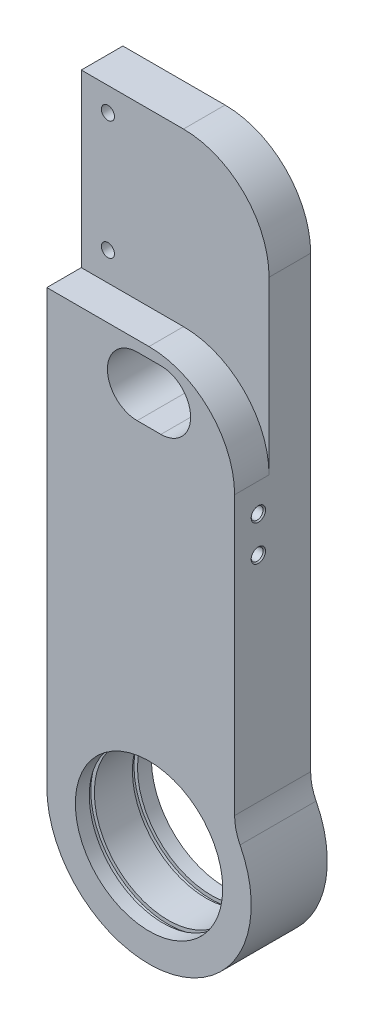
ISO-10303-21;
HEADER;
FILE_DESCRIPTION(('STEP AP214'),'2;1');
FILE_NAME('part.step','',(''),(''),'','','');
FILE_SCHEMA(('AUTOMOTIVE_DESIGN { 1 0 10303 214 1 1 1 1 }'));
ENDSEC;
DATA;
#1=APPLICATION_CONTEXT('core data for automotive mechanical design processes');
#2=APPLICATION_PROTOCOL_DEFINITION('international standard','automotive_design',2000,#1);
#3=PRODUCT_CONTEXT('',#1,'mechanical');
#4=PRODUCT('Part','Part','',(#3));
#5=PRODUCT_RELATED_PRODUCT_CATEGORY('part','',(#4));
#6=PRODUCT_DEFINITION_FORMATION('','',#4);
#7=PRODUCT_DEFINITION_CONTEXT('part definition',#1,'design');
#8=PRODUCT_DEFINITION('design','',#6,#7);
#9=PRODUCT_DEFINITION_SHAPE('','',#8);
#10=(LENGTH_UNIT() NAMED_UNIT(*) SI_UNIT(.MILLI.,.METRE.));
#11=(NAMED_UNIT(*) PLANE_ANGLE_UNIT() SI_UNIT($,.RADIAN.));
#12=(NAMED_UNIT(*) SI_UNIT($,.STERADIAN.) SOLID_ANGLE_UNIT());
#13=UNCERTAINTY_MEASURE_WITH_UNIT(LENGTH_MEASURE(1.E-05),#10,'distance_accuracy_value','');
#14=(GEOMETRIC_REPRESENTATION_CONTEXT(3) GLOBAL_UNCERTAINTY_ASSIGNED_CONTEXT((#13)) GLOBAL_UNIT_ASSIGNED_CONTEXT((#10,
#11,#12)) REPRESENTATION_CONTEXT('',''));
#15=CARTESIAN_POINT('',(0.,0.,0.));
#16=DIRECTION('',(0.,0.,1.));
#17=DIRECTION('',(1.,0.,0.));
#18=AXIS2_PLACEMENT_3D('',#15,#16,#17);
#19=CARTESIAN_POINT('',(36.,29.1032644217105,32.));
#20=DIRECTION('',(-1.,0.,0.));
#21=DIRECTION('',(0.,-1.,0.));
#22=AXIS2_PLACEMENT_3D('',#19,#20,#21);
#23=PLANE('',#22);
#24=CARTESIAN_POINT('',(36.,134.,22.));
#25=DIRECTION('',(1.,0.,0.));
#26=DIRECTION('',(0.,0.,-1.));
#27=AXIS2_PLACEMENT_3D('',#24,#25,#26);
#28=CIRCLE('',#27,3.025);
#29=CARTESIAN_POINT('',(36.,134.,18.975));
#30=VERTEX_POINT('',#29);
#31=EDGE_CURVE('E153',#30,#30,#28,.T.);
#32=ORIENTED_EDGE('',*,*,#31,.F.);
#33=EDGE_LOOP('',(#32));
#34=FACE_BOUND('',#33,.T.);
#35=CARTESIAN_POINT('',(36.,119.,22.));
#36=DIRECTION('',(1.,0.,0.));
#37=DIRECTION('',(0.,0.,-1.));
#38=AXIS2_PLACEMENT_3D('',#35,#36,#37);
#39=CIRCLE('',#38,3.025);
#40=CARTESIAN_POINT('',(36.,119.,18.975));
#41=VERTEX_POINT('',#40);
#42=EDGE_CURVE('E146',#41,#41,#39,.T.);
#43=ORIENTED_EDGE('',*,*,#42,.F.);
#44=EDGE_LOOP('',(#43));
#45=FACE_BOUND('',#44,.T.);
#46=DIRECTION('',(0.,0.,1.));
#47=VECTOR('',#46,1.);
#48=CARTESIAN_POINT('',(36.,146.,17.5));
#49=LINE('',#48,#47);
#50=CARTESIAN_POINT('',(36.,146.,17.5));
#51=VERTEX_POINT('',#50);
#52=CARTESIAN_POINT('',(36.,146.,32.));
#53=VERTEX_POINT('',#52);
#54=EDGE_CURVE('E186',#51,#53,#49,.T.);
#55=ORIENTED_EDGE('',*,*,#54,.T.);
#56=DIRECTION('',(0.,1.,0.));
#57=VECTOR('',#56,1.);
#58=CARTESIAN_POINT('',(36.,29.1032644217105,32.));
#59=LINE('',#58,#57);
#60=CARTESIAN_POINT('',(36.,29.1032644217105,32.));
#61=VERTEX_POINT('',#60);
#62=EDGE_CURVE('E257',#61,#53,#59,.T.);
#63=ORIENTED_EDGE('',*,*,#62,.F.);
#64=DIRECTION('',(0.,0.,-1.));
#65=VECTOR('',#64,1.);
#66=CARTESIAN_POINT('',(36.,29.1032644217105,32.));
#67=LINE('',#66,#65);
#68=CARTESIAN_POINT('',(36.,29.1032644217105,0.));
#69=VERTEX_POINT('',#68);
#70=EDGE_CURVE('E285',#61,#69,#67,.T.);
#71=ORIENTED_EDGE('',*,*,#70,.T.);
#72=DIRECTION('',(0.,1.,0.));
#73=VECTOR('',#72,1.);
#74=CARTESIAN_POINT('',(36.,29.1032644217105,0.));
#75=LINE('',#74,#73);
#76=CARTESIAN_POINT('',(36.,218.,0.));
#77=VERTEX_POINT('',#76);
#78=EDGE_CURVE('E267',#69,#77,#75,.T.);
#79=ORIENTED_EDGE('',*,*,#78,.T.);
#80=DIRECTION('',(0.,0.,-1.));
#81=VECTOR('',#80,1.);
#82=CARTESIAN_POINT('',(36.,218.,32.));
#83=LINE('',#82,#81);
#84=CARTESIAN_POINT('',(36.,218.,17.5));
#85=VERTEX_POINT('',#84);
#86=EDGE_CURVE('E283',#85,#77,#83,.T.);
#87=ORIENTED_EDGE('',*,*,#86,.F.);
#88=DIRECTION('',(0.,-1.,0.));
#89=VECTOR('',#88,1.);
#90=CARTESIAN_POINT('',(36.,29.1032644217105,17.5));
#91=LINE('',#90,#89);
#92=EDGE_CURVE('E196',#85,#51,#91,.T.);
#93=ORIENTED_EDGE('',*,*,#92,.T.);
#94=EDGE_LOOP('',(#55,#63,#71,#79,#87,#93));
#95=FACE_BOUND('',#94,.T.);
#96=ADVANCED_FACE('F38',(#34,#45,#95),#23,.F.);
#97=CARTESIAN_POINT('',(0.,0.,32.));
#98=DIRECTION('',(0.,0.,-1.));
#99=DIRECTION('',(-1.,0.,0.));
#100=AXIS2_PLACEMENT_3D('',#97,#98,#99);
#101=CYLINDRICAL_SURFACE('',#100,31.);
#102=CARTESIAN_POINT('',(0.,0.,26.15));
#103=DIRECTION('',(0.,0.,1.));
#104=DIRECTION('',(1.,0.,0.));
#105=AXIS2_PLACEMENT_3D('',#102,#103,#104);
#106=CIRCLE('',#105,31.);
#107=CARTESIAN_POINT('',(31.,0.,26.15));
#108=VERTEX_POINT('',#107);
#109=EDGE_CURVE('E210',#108,#108,#106,.T.);
#110=ORIENTED_EDGE('',*,*,#109,.F.);
#111=EDGE_LOOP('',(#110));
#112=FACE_BOUND('',#111,.T.);
#113=CARTESIAN_POINT('',(0.,0.,32.));
#114=DIRECTION('',(0.,0.,1.));
#115=DIRECTION('',(1.,0.,0.));
#116=AXIS2_PLACEMENT_3D('',#113,#114,#115);
#117=CIRCLE('',#116,31.);
#118=CARTESIAN_POINT('',(31.,0.,32.));
#119=VERTEX_POINT('',#118);
#120=EDGE_CURVE('E245',#119,#119,#117,.T.);
#121=ORIENTED_EDGE('',*,*,#120,.T.);
#122=EDGE_LOOP('',(#121));
#123=FACE_BOUND('',#122,.T.);
#124=ADVANCED_FACE('F301',(#112,#123),#101,.F.);
#125=CARTESIAN_POINT('',(0.,0.,24.));
#126=DIRECTION('',(0.,0.,-1.));
#127=DIRECTION('',(-1.,0.,0.));
#128=AXIS2_PLACEMENT_3D('',#125,#126,#127);
#129=CIRCLE('',#128,31.);
#130=CARTESIAN_POINT('',(-31.,0.,24.));
#131=VERTEX_POINT('',#130);
#132=EDGE_CURVE('E205',#131,#131,#129,.T.);
#133=ORIENTED_EDGE('',*,*,#132,.F.);
#134=EDGE_LOOP('',(#133));
#135=FACE_BOUND('',#134,.T.);
#136=CARTESIAN_POINT('',(0.,0.,8.));
#137=DIRECTION('',(0.,0.,1.));
#138=DIRECTION('',(1.,0.,0.));
#139=AXIS2_PLACEMENT_3D('',#136,#137,#138);
#140=CIRCLE('',#139,31.);
#141=CARTESIAN_POINT('',(31.,0.,8.));
#142=VERTEX_POINT('',#141);
#143=EDGE_CURVE('E228',#142,#142,#140,.T.);
#144=ORIENTED_EDGE('',*,*,#143,.F.);
#145=EDGE_LOOP('',(#144));
#146=FACE_BOUND('',#145,.T.);
#147=ADVANCED_FACE('F304',(#135,#146),#101,.F.);
#148=CARTESIAN_POINT('',(0.,0.,32.));
#149=DIRECTION('',(0.,0.,1.));
#150=DIRECTION('',(1.,0.,0.));
#151=AXIS2_PLACEMENT_3D('',#148,#149,#150);
#152=PLANE('',#151);
#153=CARTESIAN_POINT('',(0.,146.,32.));
#154=DIRECTION('',(0.,0.,-1.));
#155=DIRECTION('',(-1.,0.,0.));
#156=AXIS2_PLACEMENT_3D('',#153,#154,#155);
#157=CIRCLE('',#156,36.);
#158=CARTESIAN_POINT('',(0.,182.,32.));
#159=VERTEX_POINT('',#158);
#160=EDGE_CURVE('E179',#159,#53,#157,.T.);
#161=ORIENTED_EDGE('',*,*,#160,.F.);
#162=DIRECTION('',(1.,0.,0.));
#163=VECTOR('',#162,1.);
#164=CARTESIAN_POINT('',(-43.,182.,32.));
#165=LINE('',#164,#163);
#166=CARTESIAN_POINT('',(-43.,182.,32.));
#167=VERTEX_POINT('',#166);
#168=EDGE_CURVE('E174',#167,#159,#165,.T.);
#169=ORIENTED_EDGE('',*,*,#168,.F.);
#170=DIRECTION('',(0.,-1.,0.));
#171=VECTOR('',#170,1.);
#172=CARTESIAN_POINT('',(-43.,0.,32.));
#173=LINE('',#172,#171);
#174=CARTESIAN_POINT('',(-43.,0.,32.));
#175=VERTEX_POINT('',#174);
#176=EDGE_CURVE('E260',#167,#175,#173,.T.);
#177=ORIENTED_EDGE('',*,*,#176,.T.);
#178=CARTESIAN_POINT('',(0.,0.,32.));
#179=DIRECTION('',(0.,0.,1.));
#180=DIRECTION('',(1.,0.,0.));
#181=AXIS2_PLACEMENT_3D('',#178,#179,#180);
#182=CIRCLE('',#181,43.);
#183=CARTESIAN_POINT('',(38.296875,19.5537557833367,32.));
#184=VERTEX_POINT('',#183);
#185=EDGE_CURVE('E251',#175,#184,#182,.T.);
#186=ORIENTED_EDGE('',*,*,#185,.T.);
#187=CARTESIAN_POINT('',(57.,29.1032644217105,32.));
#188=DIRECTION('',(0.,0.,-1.));
#189=DIRECTION('',(-1.,0.,0.));
#190=AXIS2_PLACEMENT_3D('',#187,#188,#189);
#191=CIRCLE('',#190,21.);
#192=EDGE_CURVE('E254',#184,#61,#191,.T.);
#193=ORIENTED_EDGE('',*,*,#192,.T.);
#194=ORIENTED_EDGE('',*,*,#62,.T.);
#195=EDGE_LOOP('',(#161,#169,#177,#186,#193,#194));
#196=FACE_BOUND('',#195,.T.);
#197=ORIENTED_EDGE('',*,*,#120,.F.);
#198=EDGE_LOOP('',(#197));
#199=FACE_BOUND('',#198,.T.);
#200=DIRECTION('',(-1.,0.,0.));
#201=VECTOR('',#200,1.);
#202=CARTESIAN_POINT('',(5.00000000000001,177.5,32.));
#203=LINE('',#202,#201);
#204=CARTESIAN_POINT('',(5.00000000000001,177.5,32.));
#205=VERTEX_POINT('',#204);
#206=CARTESIAN_POINT('',(-5.,177.5,32.));
#207=VERTEX_POINT('',#206);
#208=EDGE_CURVE('E216',#205,#207,#203,.T.);
#209=ORIENTED_EDGE('',*,*,#208,.F.);
#210=CARTESIAN_POINT('',(5.00000000000001,165.,32.));
#211=DIRECTION('',(0.,0.,1.));
#212=DIRECTION('',(1.,0.,0.));
#213=AXIS2_PLACEMENT_3D('',#210,#211,#212);
#214=CIRCLE('',#213,12.5);
#215=CARTESIAN_POINT('',(5.00000000000001,152.5,32.));
#216=VERTEX_POINT('',#215);
#217=EDGE_CURVE('E214',#216,#205,#214,.T.);
#218=ORIENTED_EDGE('',*,*,#217,.F.);
#219=DIRECTION('',(1.,0.,0.));
#220=VECTOR('',#219,1.);
#221=CARTESIAN_POINT('',(5.00000000000001,152.5,32.));
#222=LINE('',#221,#220);
#223=CARTESIAN_POINT('',(-4.99999999999999,152.5,32.));
#224=VERTEX_POINT('',#223);
#225=EDGE_CURVE('E221',#224,#216,#222,.T.);
#226=ORIENTED_EDGE('',*,*,#225,.F.);
#227=CARTESIAN_POINT('',(-4.99999999999999,165.,32.));
#228=DIRECTION('',(0.,0.,1.));
#229=DIRECTION('',(1.,0.,0.));
#230=AXIS2_PLACEMENT_3D('',#227,#228,#229);
#231=CIRCLE('',#230,12.5);
#232=EDGE_CURVE('E219',#207,#224,#231,.T.);
#233=ORIENTED_EDGE('',*,*,#232,.F.);
#234=EDGE_LOOP('',(#209,#218,#226,#233));
#235=FACE_BOUND('',#234,.T.);
#236=ADVANCED_FACE('F309',(#196,#199,#235),#152,.T.);
#237=CARTESIAN_POINT('',(0.,0.,0.));
#238=DIRECTION('',(0.,0.,1.));
#239=DIRECTION('',(1.,0.,0.));
#240=AXIS2_PLACEMENT_3D('',#237,#238,#239);
#241=PLANE('',#240);
#242=CARTESIAN_POINT('',(-31.8,194.,0.));
#243=DIRECTION('',(0.,0.,1.));
#244=DIRECTION('',(1.,0.,0.));
#245=AXIS2_PLACEMENT_3D('',#242,#243,#244);
#246=CIRCLE('',#245,2.75);
#247=CARTESIAN_POINT('',(-29.05,194.,0.));
#248=VERTEX_POINT('',#247);
#249=EDGE_CURVE('E165',#248,#248,#246,.T.);
#250=ORIENTED_EDGE('',*,*,#249,.T.);
#251=EDGE_LOOP('',(#250));
#252=FACE_BOUND('',#251,.T.);
#253=CARTESIAN_POINT('',(-31.8,244.,0.));
#254=DIRECTION('',(0.,0.,1.));
#255=DIRECTION('',(1.,0.,0.));
#256=AXIS2_PLACEMENT_3D('',#253,#254,#255);
#257=CIRCLE('',#256,2.75);
#258=CARTESIAN_POINT('',(-29.05,244.,0.));
#259=VERTEX_POINT('',#258);
#260=EDGE_CURVE('E171',#259,#259,#257,.T.);
#261=ORIENTED_EDGE('',*,*,#260,.T.);
#262=EDGE_LOOP('',(#261));
#263=FACE_BOUND('',#262,.T.);
#264=CARTESIAN_POINT('',(0.,0.,0.));
#265=DIRECTION('',(0.,0.,1.));
#266=DIRECTION('',(1.,0.,0.));
#267=AXIS2_PLACEMENT_3D('',#264,#265,#266);
#268=CIRCLE('',#267,31.);
#269=CARTESIAN_POINT('',(31.,0.,0.));
#270=VERTEX_POINT('',#269);
#271=EDGE_CURVE('E244',#270,#270,#268,.T.);
#272=ORIENTED_EDGE('',*,*,#271,.T.);
#273=EDGE_LOOP('',(#272));
#274=FACE_BOUND('',#273,.T.);
#275=CARTESIAN_POINT('',(0.,0.,0.));
#276=DIRECTION('',(0.,0.,1.));
#277=DIRECTION('',(1.,0.,0.));
#278=AXIS2_PLACEMENT_3D('',#275,#276,#277);
#279=CIRCLE('',#278,43.);
#280=CARTESIAN_POINT('',(-43.,0.,0.));
#281=VERTEX_POINT('',#280);
#282=CARTESIAN_POINT('',(38.296875,19.5537557833367,0.));
#283=VERTEX_POINT('',#282);
#284=EDGE_CURVE('E248',#281,#283,#279,.T.);
#285=ORIENTED_EDGE('',*,*,#284,.F.);
#286=DIRECTION('',(0.,-1.,0.));
#287=VECTOR('',#286,1.);
#288=CARTESIAN_POINT('',(-43.,0.,0.));
#289=LINE('',#288,#287);
#290=CARTESIAN_POINT('',(-43.,254.,0.));
#291=VERTEX_POINT('',#290);
#292=EDGE_CURVE('E255',#291,#281,#289,.T.);
#293=ORIENTED_EDGE('',*,*,#292,.F.);
#294=DIRECTION('',(-1.,0.,0.));
#295=VECTOR('',#294,1.);
#296=CARTESIAN_POINT('',(-43.,254.,0.));
#297=LINE('',#296,#295);
#298=CARTESIAN_POINT('',(0.,254.,0.));
#299=VERTEX_POINT('',#298);
#300=EDGE_CURVE('E273',#299,#291,#297,.T.);
#301=ORIENTED_EDGE('',*,*,#300,.F.);
#302=CARTESIAN_POINT('',(0.,218.,0.));
#303=DIRECTION('',(0.,0.,1.));
#304=DIRECTION('',(1.,0.,0.));
#305=AXIS2_PLACEMENT_3D('',#302,#303,#304);
#306=CIRCLE('',#305,36.);
#307=EDGE_CURVE('E270',#77,#299,#306,.T.);
#308=ORIENTED_EDGE('',*,*,#307,.F.);
#309=ORIENTED_EDGE('',*,*,#78,.F.);
#310=CARTESIAN_POINT('',(57.,29.1032644217105,0.));
#311=DIRECTION('',(0.,0.,-1.));
#312=DIRECTION('',(-1.,0.,0.));
#313=AXIS2_PLACEMENT_3D('',#310,#311,#312);
#314=CIRCLE('',#313,21.);
#315=EDGE_CURVE('E265',#283,#69,#314,.T.);
#316=ORIENTED_EDGE('',*,*,#315,.F.);
#317=EDGE_LOOP('',(#285,#293,#301,#308,#309,#316));
#318=FACE_BOUND('',#317,.T.);
#319=CARTESIAN_POINT('',(5.00000000000001,165.,0.));
#320=DIRECTION('',(0.,0.,1.));
#321=DIRECTION('',(1.,0.,0.));
#322=AXIS2_PLACEMENT_3D('',#319,#320,#321);
#323=CIRCLE('',#322,12.5);
#324=CARTESIAN_POINT('',(5.00000000000001,152.5,0.));
#325=VERTEX_POINT('',#324);
#326=CARTESIAN_POINT('',(5.00000000000001,177.5,0.));
#327=VERTEX_POINT('',#326);
#328=EDGE_CURVE('E224',#325,#327,#323,.T.);
#329=ORIENTED_EDGE('',*,*,#328,.T.);
#330=DIRECTION('',(-1.,0.,0.));
#331=VECTOR('',#330,1.);
#332=CARTESIAN_POINT('',(5.00000000000001,177.5,0.));
#333=LINE('',#332,#331);
#334=CARTESIAN_POINT('',(-5.,177.5,0.));
#335=VERTEX_POINT('',#334);
#336=EDGE_CURVE('E227',#327,#335,#333,.T.);
#337=ORIENTED_EDGE('',*,*,#336,.T.);
#338=CARTESIAN_POINT('',(-4.99999999999999,165.,0.));
#339=DIRECTION('',(0.,0.,1.));
#340=DIRECTION('',(1.,0.,0.));
#341=AXIS2_PLACEMENT_3D('',#338,#339,#340);
#342=CIRCLE('',#341,12.5);
#343=CARTESIAN_POINT('',(-4.99999999999999,152.5,0.));
#344=VERTEX_POINT('',#343);
#345=EDGE_CURVE('E231',#335,#344,#342,.T.);
#346=ORIENTED_EDGE('',*,*,#345,.T.);
#347=DIRECTION('',(1.,0.,0.));
#348=VECTOR('',#347,1.);
#349=CARTESIAN_POINT('',(5.00000000000001,152.5,0.));
#350=LINE('',#349,#348);
#351=EDGE_CURVE('E217',#344,#325,#350,.T.);
#352=ORIENTED_EDGE('',*,*,#351,.T.);
#353=EDGE_LOOP('',(#329,#337,#346,#352));
#354=FACE_BOUND('',#353,.T.);
#355=ADVANCED_FACE('F312',(#252,#263,#274,#318,#354),#241,.F.);
#356=CARTESIAN_POINT('',(0.,0.,32.));
#357=DIRECTION('',(0.,0.,-1.));
#358=DIRECTION('',(-1.,0.,0.));
#359=AXIS2_PLACEMENT_3D('',#356,#357,#358);
#360=CYLINDRICAL_SURFACE('',#359,43.);
#361=ORIENTED_EDGE('',*,*,#284,.T.);
#362=DIRECTION('',(0.,0.,-1.));
#363=VECTOR('',#362,1.);
#364=CARTESIAN_POINT('',(38.296875,19.5537557833367,32.));
#365=LINE('',#364,#363);
#366=EDGE_CURVE('E46',#184,#283,#365,.T.);
#367=ORIENTED_EDGE('',*,*,#366,.F.);
#368=ORIENTED_EDGE('',*,*,#185,.F.);
#369=DIRECTION('',(0.,0.,-1.));
#370=VECTOR('',#369,1.);
#371=CARTESIAN_POINT('',(-43.,0.,32.));
#372=LINE('',#371,#370);
#373=EDGE_CURVE('E262',#175,#281,#372,.T.);
#374=ORIENTED_EDGE('',*,*,#373,.T.);
#375=EDGE_LOOP('',(#361,#367,#368,#374));
#376=FACE_BOUND('',#375,.T.);
#377=ADVANCED_FACE('F40',(#376),#360,.T.);
#378=CARTESIAN_POINT('',(57.,29.1032644217105,32.));
#379=DIRECTION('',(0.,0.,-1.));
#380=DIRECTION('',(-1.,0.,0.));
#381=AXIS2_PLACEMENT_3D('',#378,#379,#380);
#382=CYLINDRICAL_SURFACE('',#381,21.);
#383=ORIENTED_EDGE('',*,*,#315,.T.);
#384=ORIENTED_EDGE('',*,*,#70,.F.);
#385=ORIENTED_EDGE('',*,*,#192,.F.);
#386=ORIENTED_EDGE('',*,*,#366,.T.);
#387=EDGE_LOOP('',(#383,#384,#385,#386));
#388=FACE_BOUND('',#387,.T.);
#389=ADVANCED_FACE('F352',(#388),#382,.F.);
#390=CARTESIAN_POINT('',(0.,218.,32.));
#391=DIRECTION('',(0.,0.,-1.));
#392=DIRECTION('',(-1.,0.,0.));
#393=AXIS2_PLACEMENT_3D('',#390,#391,#392);
#394=CYLINDRICAL_SURFACE('',#393,36.);
#395=DIRECTION('',(0.,0.,-1.));
#396=VECTOR('',#395,1.);
#397=CARTESIAN_POINT('',(0.,254.,32.));
#398=LINE('',#397,#396);
#399=CARTESIAN_POINT('',(0.,254.,17.5));
#400=VERTEX_POINT('',#399);
#401=EDGE_CURVE('E281',#400,#299,#398,.T.);
#402=ORIENTED_EDGE('',*,*,#401,.F.);
#403=CARTESIAN_POINT('',(0.,218.,17.5));
#404=DIRECTION('',(0.,0.,-1.));
#405=DIRECTION('',(-1.,0.,0.));
#406=AXIS2_PLACEMENT_3D('',#403,#404,#405);
#407=CIRCLE('',#406,36.);
#408=EDGE_CURVE('E193',#400,#85,#407,.T.);
#409=ORIENTED_EDGE('',*,*,#408,.T.);
#410=ORIENTED_EDGE('',*,*,#86,.T.);
#411=ORIENTED_EDGE('',*,*,#307,.T.);
#412=EDGE_LOOP('',(#402,#409,#410,#411));
#413=FACE_BOUND('',#412,.T.);
#414=ADVANCED_FACE('F350',(#413),#394,.T.);
#415=CARTESIAN_POINT('',(-43.,254.,32.));
#416=DIRECTION('',(0.,-1.,0.));
#417=DIRECTION('',(0.,0.,-1.));
#418=AXIS2_PLACEMENT_3D('',#415,#416,#417);
#419=PLANE('',#418);
#420=DIRECTION('',(0.,0.,-1.));
#421=VECTOR('',#420,1.);
#422=CARTESIAN_POINT('',(-43.,254.,32.));
#423=LINE('',#422,#421);
#424=CARTESIAN_POINT('',(-43.,254.,17.5));
#425=VERTEX_POINT('',#424);
#426=EDGE_CURVE('E279',#425,#291,#423,.T.);
#427=ORIENTED_EDGE('',*,*,#426,.F.);
#428=DIRECTION('',(1.,0.,0.));
#429=VECTOR('',#428,1.);
#430=CARTESIAN_POINT('',(-43.,254.,17.5));
#431=LINE('',#430,#429);
#432=EDGE_CURVE('E53',#425,#400,#431,.T.);
#433=ORIENTED_EDGE('',*,*,#432,.T.);
#434=ORIENTED_EDGE('',*,*,#401,.T.);
#435=ORIENTED_EDGE('',*,*,#300,.T.);
#436=EDGE_LOOP('',(#427,#433,#434,#435));
#437=FACE_BOUND('',#436,.T.);
#438=ADVANCED_FACE('F359',(#437),#419,.F.);
#439=CARTESIAN_POINT('',(-43.,0.,32.));
#440=DIRECTION('',(1.,0.,0.));
#441=DIRECTION('',(0.,0.,-1.));
#442=AXIS2_PLACEMENT_3D('',#439,#440,#441);
#443=PLANE('',#442);
#444=ORIENTED_EDGE('',*,*,#176,.F.);
#445=DIRECTION('',(0.,0.,1.));
#446=VECTOR('',#445,1.);
#447=CARTESIAN_POINT('',(-43.,182.,17.5));
#448=LINE('',#447,#446);
#449=CARTESIAN_POINT('',(-43.,182.,17.5));
#450=VERTEX_POINT('',#449);
#451=EDGE_CURVE('E182',#450,#167,#448,.T.);
#452=ORIENTED_EDGE('',*,*,#451,.F.);
#453=DIRECTION('',(0.,1.,0.));
#454=VECTOR('',#453,1.);
#455=CARTESIAN_POINT('',(-43.,0.,17.5));
#456=LINE('',#455,#454);
#457=EDGE_CURVE('E11',#450,#425,#456,.T.);
#458=ORIENTED_EDGE('',*,*,#457,.T.);
#459=ORIENTED_EDGE('',*,*,#426,.T.);
#460=ORIENTED_EDGE('',*,*,#292,.T.);
#461=ORIENTED_EDGE('',*,*,#373,.F.);
#462=EDGE_LOOP('',(#444,#452,#458,#459,#460,#461));
#463=FACE_BOUND('',#462,.T.);
#464=ADVANCED_FACE('F385',(#463),#443,.F.);
#465=CARTESIAN_POINT('',(0.,0.,5.85));
#466=DIRECTION('',(0.,0.,-1.));
#467=DIRECTION('',(-1.,0.,0.));
#468=AXIS2_PLACEMENT_3D('',#465,#466,#467);
#469=CIRCLE('',#468,31.);
#470=CARTESIAN_POINT('',(-31.,0.,5.85));
#471=VERTEX_POINT('',#470);
#472=EDGE_CURVE('E213',#471,#471,#469,.T.);
#473=ORIENTED_EDGE('',*,*,#472,.F.);
#474=EDGE_LOOP('',(#473));
#475=FACE_BOUND('',#474,.T.);
#476=ORIENTED_EDGE('',*,*,#271,.F.);
#477=EDGE_LOOP('',(#476));
#478=FACE_BOUND('',#477,.T.);
#479=ADVANCED_FACE('F306',(#475,#478),#101,.F.);
#480=CARTESIAN_POINT('',(5.00000000000001,165.,32.));
#481=DIRECTION('',(0.,0.,-1.));
#482=DIRECTION('',(-1.,0.,0.));
#483=AXIS2_PLACEMENT_3D('',#480,#481,#482);
#484=CYLINDRICAL_SURFACE('',#483,12.5);
#485=ORIENTED_EDGE('',*,*,#328,.F.);
#486=DIRECTION('',(0.,0.,-1.));
#487=VECTOR('',#486,1.);
#488=CARTESIAN_POINT('',(5.00000000000001,152.5,32.));
#489=LINE('',#488,#487);
#490=EDGE_CURVE('E223',#216,#325,#489,.T.);
#491=ORIENTED_EDGE('',*,*,#490,.F.);
#492=ORIENTED_EDGE('',*,*,#217,.T.);
#493=DIRECTION('',(0.,0.,-1.));
#494=VECTOR('',#493,1.);
#495=CARTESIAN_POINT('',(5.00000000000001,177.5,32.));
#496=LINE('',#495,#494);
#497=EDGE_CURVE('E241',#205,#327,#496,.T.);
#498=ORIENTED_EDGE('',*,*,#497,.T.);
#499=EDGE_LOOP('',(#485,#491,#492,#498));
#500=FACE_BOUND('',#499,.T.);
#501=ADVANCED_FACE('F328',(#500),#484,.F.);
#502=CARTESIAN_POINT('',(5.00000000000001,177.5,32.));
#503=DIRECTION('',(0.,-1.,0.));
#504=DIRECTION('',(0.,0.,-1.));
#505=AXIS2_PLACEMENT_3D('',#502,#503,#504);
#506=PLANE('',#505);
#507=ORIENTED_EDGE('',*,*,#336,.F.);
#508=ORIENTED_EDGE('',*,*,#497,.F.);
#509=ORIENTED_EDGE('',*,*,#208,.T.);
#510=DIRECTION('',(0.,0.,-1.));
#511=VECTOR('',#510,1.);
#512=CARTESIAN_POINT('',(-5.,177.5,32.));
#513=LINE('',#512,#511);
#514=EDGE_CURVE('E239',#207,#335,#513,.T.);
#515=ORIENTED_EDGE('',*,*,#514,.T.);
#516=EDGE_LOOP('',(#507,#508,#509,#515));
#517=FACE_BOUND('',#516,.T.);
#518=ADVANCED_FACE('F322',(#517),#506,.T.);
#519=CARTESIAN_POINT('',(-4.99999999999999,165.,32.));
#520=DIRECTION('',(0.,0.,-1.));
#521=DIRECTION('',(-1.,0.,0.));
#522=AXIS2_PLACEMENT_3D('',#519,#520,#521);
#523=CYLINDRICAL_SURFACE('',#522,12.5);
#524=ORIENTED_EDGE('',*,*,#345,.F.);
#525=ORIENTED_EDGE('',*,*,#514,.F.);
#526=ORIENTED_EDGE('',*,*,#232,.T.);
#527=DIRECTION('',(0.,0.,-1.));
#528=VECTOR('',#527,1.);
#529=CARTESIAN_POINT('',(-4.99999999999999,152.5,32.));
#530=LINE('',#529,#528);
#531=EDGE_CURVE('E60',#224,#344,#530,.T.);
#532=ORIENTED_EDGE('',*,*,#531,.T.);
#533=EDGE_LOOP('',(#524,#525,#526,#532));
#534=FACE_BOUND('',#533,.T.);
#535=ADVANCED_FACE('F325',(#534),#523,.F.);
#536=CARTESIAN_POINT('',(5.00000000000001,152.5,32.));
#537=DIRECTION('',(0.,1.,0.));
#538=DIRECTION('',(0.,0.,1.));
#539=AXIS2_PLACEMENT_3D('',#536,#537,#538);
#540=PLANE('',#539);
#541=ORIENTED_EDGE('',*,*,#351,.F.);
#542=ORIENTED_EDGE('',*,*,#531,.F.);
#543=ORIENTED_EDGE('',*,*,#225,.T.);
#544=ORIENTED_EDGE('',*,*,#490,.T.);
#545=EDGE_LOOP('',(#541,#542,#543,#544));
#546=FACE_BOUND('',#545,.T.);
#547=ADVANCED_FACE('F330',(#546),#540,.T.);
#548=CARTESIAN_POINT('',(0.,0.,0.));
#549=DIRECTION('',(0.,0.,-1.));
#550=DIRECTION('',(-1.,0.,0.));
#551=AXIS2_PLACEMENT_3D('',#548,#549,#550);
#552=CYLINDRICAL_SURFACE('',#551,32.5);
#553=CARTESIAN_POINT('',(0.,0.,8.));
#554=DIRECTION('',(0.,0.,-1.));
#555=DIRECTION('',(-1.,0.,0.));
#556=AXIS2_PLACEMENT_3D('',#553,#554,#555);
#557=CIRCLE('',#556,32.5);
#558=CARTESIAN_POINT('',(-32.5,0.,8.));
#559=VERTEX_POINT('',#558);
#560=EDGE_CURVE('E209',#559,#559,#557,.T.);
#561=ORIENTED_EDGE('',*,*,#560,.F.);
#562=EDGE_LOOP('',(#561));
#563=FACE_BOUND('',#562,.T.);
#564=CARTESIAN_POINT('',(0.,0.,5.85));
#565=DIRECTION('',(0.,0.,-1.));
#566=DIRECTION('',(-1.,0.,0.));
#567=AXIS2_PLACEMENT_3D('',#564,#565,#566);
#568=CIRCLE('',#567,32.5);
#569=CARTESIAN_POINT('',(-32.5,0.,5.85));
#570=VERTEX_POINT('',#569);
#571=EDGE_CURVE('E206',#570,#570,#568,.T.);
#572=ORIENTED_EDGE('',*,*,#571,.T.);
#573=EDGE_LOOP('',(#572));
#574=FACE_BOUND('',#573,.T.);
#575=ADVANCED_FACE('F332',(#563,#574),#552,.F.);
#576=CARTESIAN_POINT('',(-32.5,0.,8.));
#577=DIRECTION('',(0.,0.,1.));
#578=DIRECTION('',(1.,0.,0.));
#579=AXIS2_PLACEMENT_3D('',#576,#577,#578);
#580=PLANE('',#579);
#581=ORIENTED_EDGE('',*,*,#143,.T.);
#582=EDGE_LOOP('',(#581));
#583=FACE_BOUND('',#582,.T.);
#584=ORIENTED_EDGE('',*,*,#560,.T.);
#585=EDGE_LOOP('',(#584));
#586=FACE_BOUND('',#585,.T.);
#587=ADVANCED_FACE('F338',(#583,#586),#580,.F.);
#588=CARTESIAN_POINT('',(-32.5,0.,5.85));
#589=DIRECTION('',(0.,0.,-1.));
#590=DIRECTION('',(-1.,0.,0.));
#591=AXIS2_PLACEMENT_3D('',#588,#589,#590);
#592=PLANE('',#591);
#593=ORIENTED_EDGE('',*,*,#472,.T.);
#594=EDGE_LOOP('',(#593));
#595=FACE_BOUND('',#594,.T.);
#596=ORIENTED_EDGE('',*,*,#571,.F.);
#597=EDGE_LOOP('',(#596));
#598=FACE_BOUND('',#597,.T.);
#599=ADVANCED_FACE('F452',(#595,#598),#592,.F.);
#600=CARTESIAN_POINT('',(0.,0.,0.));
#601=DIRECTION('',(0.,0.,-1.));
#602=DIRECTION('',(-1.,0.,0.));
#603=AXIS2_PLACEMENT_3D('',#600,#601,#602);
#604=CYLINDRICAL_SURFACE('',#603,32.5);
#605=CARTESIAN_POINT('',(0.,0.,26.15));
#606=DIRECTION('',(0.,0.,-1.));
#607=DIRECTION('',(-1.,0.,0.));
#608=AXIS2_PLACEMENT_3D('',#605,#606,#607);
#609=CIRCLE('',#608,32.5);
#610=CARTESIAN_POINT('',(-32.5,0.,26.15));
#611=VERTEX_POINT('',#610);
#612=EDGE_CURVE('E202',#611,#611,#609,.T.);
#613=ORIENTED_EDGE('',*,*,#612,.F.);
#614=EDGE_LOOP('',(#613));
#615=FACE_BOUND('',#614,.T.);
#616=CARTESIAN_POINT('',(0.,0.,24.));
#617=DIRECTION('',(0.,0.,-1.));
#618=DIRECTION('',(-1.,0.,0.));
#619=AXIS2_PLACEMENT_3D('',#616,#617,#618);
#620=CIRCLE('',#619,32.5);
#621=CARTESIAN_POINT('',(-32.5,0.,24.));
#622=VERTEX_POINT('',#621);
#623=EDGE_CURVE('E199',#622,#622,#620,.T.);
#624=ORIENTED_EDGE('',*,*,#623,.T.);
#625=EDGE_LOOP('',(#624));
#626=FACE_BOUND('',#625,.T.);
#627=ADVANCED_FACE('F462',(#615,#626),#604,.F.);
#628=CARTESIAN_POINT('',(-32.5,0.,26.15));
#629=DIRECTION('',(0.,0.,1.));
#630=DIRECTION('',(1.,0.,0.));
#631=AXIS2_PLACEMENT_3D('',#628,#629,#630);
#632=PLANE('',#631);
#633=ORIENTED_EDGE('',*,*,#109,.T.);
#634=EDGE_LOOP('',(#633));
#635=FACE_BOUND('',#634,.T.);
#636=ORIENTED_EDGE('',*,*,#612,.T.);
#637=EDGE_LOOP('',(#636));
#638=FACE_BOUND('',#637,.T.);
#639=ADVANCED_FACE('F298',(#635,#638),#632,.F.);
#640=CARTESIAN_POINT('',(-32.5,0.,24.));
#641=DIRECTION('',(0.,0.,-1.));
#642=DIRECTION('',(-1.,0.,0.));
#643=AXIS2_PLACEMENT_3D('',#640,#641,#642);
#644=PLANE('',#643);
#645=ORIENTED_EDGE('',*,*,#132,.T.);
#646=EDGE_LOOP('',(#645));
#647=FACE_BOUND('',#646,.T.);
#648=ORIENTED_EDGE('',*,*,#623,.F.);
#649=EDGE_LOOP('',(#648));
#650=FACE_BOUND('',#649,.T.);
#651=ADVANCED_FACE('F481',(#647,#650),#644,.F.);
#652=CARTESIAN_POINT('',(0.,146.,17.5));
#653=DIRECTION('',(0.,0.,-1.));
#654=DIRECTION('',(-1.,0.,0.));
#655=AXIS2_PLACEMENT_3D('',#652,#653,#654);
#656=PLANE('',#655);
#657=CARTESIAN_POINT('',(-31.8,194.,17.5));
#658=DIRECTION('',(0.,0.,1.));
#659=DIRECTION('',(1.,0.,0.));
#660=AXIS2_PLACEMENT_3D('',#657,#658,#659);
#661=CIRCLE('',#660,2.75);
#662=CARTESIAN_POINT('',(-29.05,194.,17.5));
#663=VERTEX_POINT('',#662);
#664=EDGE_CURVE('E162',#663,#663,#661,.T.);
#665=ORIENTED_EDGE('',*,*,#664,.F.);
#666=EDGE_LOOP('',(#665));
#667=FACE_BOUND('',#666,.T.);
#668=CARTESIAN_POINT('',(-31.8,244.,17.5));
#669=DIRECTION('',(0.,0.,1.));
#670=DIRECTION('',(1.,0.,0.));
#671=AXIS2_PLACEMENT_3D('',#668,#669,#670);
#672=CIRCLE('',#671,2.75);
#673=CARTESIAN_POINT('',(-29.05,244.,17.5));
#674=VERTEX_POINT('',#673);
#675=EDGE_CURVE('E168',#674,#674,#672,.T.);
#676=ORIENTED_EDGE('',*,*,#675,.F.);
#677=EDGE_LOOP('',(#676));
#678=FACE_BOUND('',#677,.T.);
#679=ORIENTED_EDGE('',*,*,#408,.F.);
#680=ORIENTED_EDGE('',*,*,#432,.F.);
#681=ORIENTED_EDGE('',*,*,#457,.F.);
#682=DIRECTION('',(1.,0.,0.));
#683=VECTOR('',#682,1.);
#684=CARTESIAN_POINT('',(-43.,182.,17.5));
#685=LINE('',#684,#683);
#686=CARTESIAN_POINT('',(0.,182.,17.5));
#687=VERTEX_POINT('',#686);
#688=EDGE_CURVE('E175',#450,#687,#685,.T.);
#689=ORIENTED_EDGE('',*,*,#688,.T.);
#690=CARTESIAN_POINT('',(0.,146.,17.5));
#691=DIRECTION('',(0.,0.,-1.));
#692=DIRECTION('',(-1.,0.,0.));
#693=AXIS2_PLACEMENT_3D('',#690,#691,#692);
#694=CIRCLE('',#693,36.);
#695=EDGE_CURVE('E178',#687,#51,#694,.T.);
#696=ORIENTED_EDGE('',*,*,#695,.T.);
#697=ORIENTED_EDGE('',*,*,#92,.F.);
#698=EDGE_LOOP('',(#679,#680,#681,#689,#696,#697));
#699=FACE_BOUND('',#698,.T.);
#700=ADVANCED_FACE('F374',(#667,#678,#699),#656,.F.);
#701=CARTESIAN_POINT('',(0.,146.,17.5));
#702=DIRECTION('',(0.,0.,1.));
#703=DIRECTION('',(1.,0.,0.));
#704=AXIS2_PLACEMENT_3D('',#701,#702,#703);
#705=CYLINDRICAL_SURFACE('',#704,36.);
#706=ORIENTED_EDGE('',*,*,#160,.T.);
#707=ORIENTED_EDGE('',*,*,#54,.F.);
#708=ORIENTED_EDGE('',*,*,#695,.F.);
#709=DIRECTION('',(0.,0.,1.));
#710=VECTOR('',#709,1.);
#711=CARTESIAN_POINT('',(0.,182.,17.5));
#712=LINE('',#711,#710);
#713=EDGE_CURVE('E189',#687,#159,#712,.T.);
#714=ORIENTED_EDGE('',*,*,#713,.T.);
#715=EDGE_LOOP('',(#706,#707,#708,#714));
#716=FACE_BOUND('',#715,.T.);
#717=ADVANCED_FACE('F378',(#716),#705,.T.);
#718=CARTESIAN_POINT('',(-43.,182.,17.5));
#719=DIRECTION('',(0.,-1.,0.));
#720=DIRECTION('',(1.,0.,0.));
#721=AXIS2_PLACEMENT_3D('',#718,#719,#720);
#722=PLANE('',#721);
#723=ORIENTED_EDGE('',*,*,#168,.T.);
#724=ORIENTED_EDGE('',*,*,#713,.F.);
#725=ORIENTED_EDGE('',*,*,#688,.F.);
#726=ORIENTED_EDGE('',*,*,#451,.T.);
#727=EDGE_LOOP('',(#723,#724,#725,#726));
#728=FACE_BOUND('',#727,.T.);
#729=ADVANCED_FACE('F524',(#728),#722,.F.);
#730=CARTESIAN_POINT('',(-31.8,244.,17.5));
#731=DIRECTION('',(0.,0.,1.));
#732=DIRECTION('',(1.,0.,0.));
#733=AXIS2_PLACEMENT_3D('',#730,#731,#732);
#734=CYLINDRICAL_SURFACE('',#733,2.75);
#735=ORIENTED_EDGE('',*,*,#260,.F.);
#736=EDGE_LOOP('',(#735));
#737=FACE_BOUND('',#736,.T.);
#738=ORIENTED_EDGE('',*,*,#675,.T.);
#739=EDGE_LOOP('',(#738));
#740=FACE_BOUND('',#739,.T.);
#741=ADVANCED_FACE('F534',(#737,#740),#734,.F.);
#742=CARTESIAN_POINT('',(-31.8,194.,17.5));
#743=DIRECTION('',(0.,0.,1.));
#744=DIRECTION('',(1.,0.,0.));
#745=AXIS2_PLACEMENT_3D('',#742,#743,#744);
#746=CYLINDRICAL_SURFACE('',#745,2.75);
#747=ORIENTED_EDGE('',*,*,#249,.F.);
#748=EDGE_LOOP('',(#747));
#749=FACE_BOUND('',#748,.T.);
#750=ORIENTED_EDGE('',*,*,#664,.T.);
#751=EDGE_LOOP('',(#750));
#752=FACE_BOUND('',#751,.T.);
#753=ADVANCED_FACE('F557',(#749,#752),#746,.F.);
#754=CARTESIAN_POINT('',(19.,119.,22.));
#755=DIRECTION('',(1.,0.,0.));
#756=DIRECTION('',(0.,0.,-1.));
#757=AXIS2_PLACEMENT_3D('',#754,#755,#756);
#758=CONICAL_SURFACE('',#757,2.5,1.02974425867666);
#759=CARTESIAN_POINT('',(17.4978484524311,119.,22.));
#760=VERTEX_POINT('',#759);
#761=VERTEX_LOOP('',#760);
#762=FACE_BOUND('',#761,.T.);
#763=CARTESIAN_POINT('',(19.,119.,22.));
#764=DIRECTION('',(1.,0.,0.));
#765=DIRECTION('',(0.,0.,-1.));
#766=AXIS2_PLACEMENT_3D('',#763,#764,#765);
#767=CIRCLE('',#766,2.5);
#768=CARTESIAN_POINT('',(19.,119.,19.5));
#769=VERTEX_POINT('',#768);
#770=EDGE_CURVE('E159',#769,#769,#767,.T.);
#771=ORIENTED_EDGE('',*,*,#770,.T.);
#772=EDGE_LOOP('',(#771));
#773=FACE_BOUND('',#772,.T.);
#774=ADVANCED_FACE('F566',(#762,#773),#758,.F.);
#775=CARTESIAN_POINT('',(36.,119.,22.));
#776=DIRECTION('',(1.,0.,0.));
#777=DIRECTION('',(0.,0.,-1.));
#778=AXIS2_PLACEMENT_3D('',#775,#776,#777);
#779=CYLINDRICAL_SURFACE('',#778,2.5);
#780=ORIENTED_EDGE('',*,*,#770,.F.);
#781=EDGE_LOOP('',(#780));
#782=FACE_BOUND('',#781,.T.);
#783=CARTESIAN_POINT('',(35.475,119.,22.));
#784=DIRECTION('',(1.,0.,0.));
#785=DIRECTION('',(0.,0.,-1.));
#786=AXIS2_PLACEMENT_3D('',#783,#784,#785);
#787=CIRCLE('',#786,2.5);
#788=CARTESIAN_POINT('',(35.475,119.,19.5));
#789=VERTEX_POINT('',#788);
#790=EDGE_CURVE('E150',#789,#789,#787,.T.);
#791=ORIENTED_EDGE('',*,*,#790,.T.);
#792=EDGE_LOOP('',(#791));
#793=FACE_BOUND('',#792,.T.);
#794=ADVANCED_FACE('F580',(#782,#793),#779,.F.);
#795=CARTESIAN_POINT('',(36.,119.,22.));
#796=DIRECTION('',(1.,0.,0.));
#797=DIRECTION('',(0.,0.,-1.));
#798=AXIS2_PLACEMENT_3D('',#795,#796,#797);
#799=CONICAL_SURFACE('',#798,3.025,0.785398163397448);
#800=ORIENTED_EDGE('',*,*,#790,.F.);
#801=EDGE_LOOP('',(#800));
#802=FACE_BOUND('',#801,.T.);
#803=ORIENTED_EDGE('',*,*,#42,.T.);
#804=EDGE_LOOP('',(#803));
#805=FACE_BOUND('',#804,.T.);
#806=ADVANCED_FACE('F140',(#802,#805),#799,.F.);
#807=CARTESIAN_POINT('',(19.,134.,22.));
#808=DIRECTION('',(1.,0.,0.));
#809=DIRECTION('',(0.,0.,-1.));
#810=AXIS2_PLACEMENT_3D('',#807,#808,#809);
#811=CONICAL_SURFACE('',#810,2.5,1.02974425867666);
#812=CARTESIAN_POINT('',(17.4978484524311,134.,22.));
#813=VERTEX_POINT('',#812);
#814=VERTEX_LOOP('',#813);
#815=FACE_BOUND('',#814,.T.);
#816=CARTESIAN_POINT('',(19.,134.,22.));
#817=DIRECTION('',(1.,0.,0.));
#818=DIRECTION('',(0.,0.,-1.));
#819=AXIS2_PLACEMENT_3D('',#816,#817,#818);
#820=CIRCLE('',#819,2.5);
#821=CARTESIAN_POINT('',(19.,134.,19.5));
#822=VERTEX_POINT('',#821);
#823=EDGE_CURVE('E144',#822,#822,#820,.T.);
#824=ORIENTED_EDGE('',*,*,#823,.T.);
#825=EDGE_LOOP('',(#824));
#826=FACE_BOUND('',#825,.T.);
#827=ADVANCED_FACE('F136',(#815,#826),#811,.F.);
#828=CARTESIAN_POINT('',(36.,134.,22.));
#829=DIRECTION('',(1.,0.,0.));
#830=DIRECTION('',(0.,0.,-1.));
#831=AXIS2_PLACEMENT_3D('',#828,#829,#830);
#832=CYLINDRICAL_SURFACE('',#831,2.5);
#833=ORIENTED_EDGE('',*,*,#823,.F.);
#834=EDGE_LOOP('',(#833));
#835=FACE_BOUND('',#834,.T.);
#836=CARTESIAN_POINT('',(35.475,134.,22.));
#837=DIRECTION('',(1.,0.,0.));
#838=DIRECTION('',(0.,0.,-1.));
#839=AXIS2_PLACEMENT_3D('',#836,#837,#838);
#840=CIRCLE('',#839,2.5);
#841=CARTESIAN_POINT('',(35.475,134.,19.5));
#842=VERTEX_POINT('',#841);
#843=EDGE_CURVE('E147',#842,#842,#840,.T.);
#844=ORIENTED_EDGE('',*,*,#843,.T.);
#845=EDGE_LOOP('',(#844));
#846=FACE_BOUND('',#845,.T.);
#847=ADVANCED_FACE('F139',(#835,#846),#832,.F.);
#848=CARTESIAN_POINT('',(36.,134.,22.));
#849=DIRECTION('',(1.,0.,0.));
#850=DIRECTION('',(0.,0.,-1.));
#851=AXIS2_PLACEMENT_3D('',#848,#849,#850);
#852=CONICAL_SURFACE('',#851,3.025,0.785398163397448);
#853=ORIENTED_EDGE('',*,*,#843,.F.);
#854=EDGE_LOOP('',(#853));
#855=FACE_BOUND('',#854,.T.);
#856=ORIENTED_EDGE('',*,*,#31,.T.);
#857=EDGE_LOOP('',(#856));
#858=FACE_BOUND('',#857,.T.);
#859=ADVANCED_FACE('F617',(#855,#858),#852,.F.);
#860=CLOSED_SHELL('',(#96,#124,#147,#236,#355,#377,#389,#414,#438,#464,#479,#501,#518,#535,#547,
#575,#587,#599,#627,#639,#651,#700,#717,#729,#741,#753,#774,#794,#806,#827,#847,#859));
#861=MANIFOLD_SOLID_BREP('B2',#860);
#862=ADVANCED_BREP_SHAPE_REPRESENTATION('',(#18,#861),#14);
#863=SHAPE_DEFINITION_REPRESENTATION(#9,#862);
ENDSEC;
END-ISO-10303-21;
